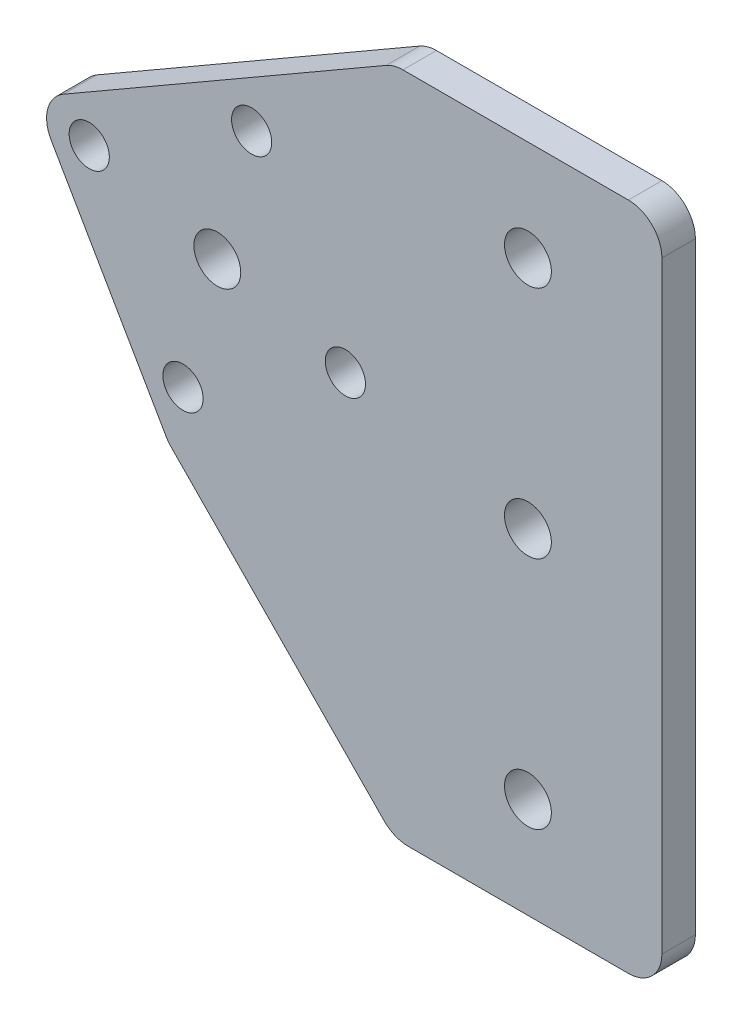
ISO-10303-21;
HEADER;
FILE_DESCRIPTION(('STEP AP214'),'2;1');
FILE_NAME('part.step','',(''),(''),'','','');
FILE_SCHEMA(('AUTOMOTIVE_DESIGN { 1 0 10303 214 1 1 1 1 }'));
ENDSEC;
DATA;
#1=APPLICATION_CONTEXT('core data for automotive mechanical design processes');
#2=APPLICATION_PROTOCOL_DEFINITION('international standard','automotive_design',2000,#1);
#3=PRODUCT_CONTEXT('',#1,'mechanical');
#4=PRODUCT('Part','Part','',(#3));
#5=PRODUCT_RELATED_PRODUCT_CATEGORY('part','',(#4));
#6=PRODUCT_DEFINITION_FORMATION('','',#4);
#7=PRODUCT_DEFINITION_CONTEXT('part definition',#1,'design');
#8=PRODUCT_DEFINITION('design','',#6,#7);
#9=PRODUCT_DEFINITION_SHAPE('','',#8);
#10=(LENGTH_UNIT() NAMED_UNIT(*) SI_UNIT(.MILLI.,.METRE.));
#11=(NAMED_UNIT(*) PLANE_ANGLE_UNIT() SI_UNIT($,.RADIAN.));
#12=(NAMED_UNIT(*) SI_UNIT($,.STERADIAN.) SOLID_ANGLE_UNIT());
#13=UNCERTAINTY_MEASURE_WITH_UNIT(LENGTH_MEASURE(1.E-05),#10,'distance_accuracy_value','');
#14=(GEOMETRIC_REPRESENTATION_CONTEXT(3) GLOBAL_UNCERTAINTY_ASSIGNED_CONTEXT((#13)) GLOBAL_UNIT_ASSIGNED_CONTEXT((#10,
#11,#12)) REPRESENTATION_CONTEXT('',''));
#15=CARTESIAN_POINT('',(0.,0.,0.));
#16=DIRECTION('',(0.,0.,1.));
#17=DIRECTION('',(1.,0.,0.));
#18=AXIS2_PLACEMENT_3D('',#15,#16,#17);
#19=CARTESIAN_POINT('',(-40.,0.,5.));
#20=DIRECTION('',(0.,1.,0.));
#21=DIRECTION('',(0.,0.,1.));
#22=AXIS2_PLACEMENT_3D('',#19,#20,#21);
#23=PLANE('',#22);
#24=DIRECTION('',(1.,0.,0.));
#25=VECTOR('',#24,1.);
#26=CARTESIAN_POINT('',(-40.,0.,0.));
#27=LINE('',#26,#25);
#28=CARTESIAN_POINT('',(-37.9002360555579,0.,0.));
#29=VERTEX_POINT('',#28);
#30=CARTESIAN_POINT('',(-5.,0.,0.));
#31=VERTEX_POINT('',#30);
#32=EDGE_CURVE('E217',#29,#31,#27,.T.);
#33=ORIENTED_EDGE('',*,*,#32,.T.);
#34=DIRECTION('',(0.,0.,-1.));
#35=VECTOR('',#34,1.);
#36=CARTESIAN_POINT('',(-5.,0.,5.));
#37=LINE('',#36,#35);
#38=CARTESIAN_POINT('',(-5.,0.,5.));
#39=VERTEX_POINT('',#38);
#40=EDGE_CURVE('E193',#31,#39,#37,.F.);
#41=ORIENTED_EDGE('',*,*,#40,.T.);
#42=DIRECTION('',(1.,0.,0.));
#43=VECTOR('',#42,1.);
#44=CARTESIAN_POINT('',(-40.,0.,5.));
#45=LINE('',#44,#43);
#46=CARTESIAN_POINT('',(-37.9002360555579,0.,5.));
#47=VERTEX_POINT('',#46);
#48=EDGE_CURVE('E160',#47,#39,#45,.T.);
#49=ORIENTED_EDGE('',*,*,#48,.F.);
#50=DIRECTION('',(0.,0.,-1.));
#51=VECTOR('',#50,1.);
#52=CARTESIAN_POINT('',(-37.9002360555579,0.,5.));
#53=LINE('',#52,#51);
#54=EDGE_CURVE('E190',#47,#29,#53,.T.);
#55=ORIENTED_EDGE('',*,*,#54,.T.);
#56=EDGE_LOOP('',(#33,#41,#49,#55));
#57=FACE_BOUND('',#56,.T.);
#58=ADVANCED_FACE('F33',(#57),#23,.F.);
#59=CARTESIAN_POINT('',(0.,0.,5.));
#60=DIRECTION('',(-1.,0.,0.));
#61=DIRECTION('',(0.,0.,1.));
#62=AXIS2_PLACEMENT_3D('',#59,#60,#61);
#63=PLANE('',#62);
#64=DIRECTION('',(0.,1.,0.));
#65=VECTOR('',#64,1.);
#66=CARTESIAN_POINT('',(0.,0.,0.));
#67=LINE('',#66,#65);
#68=CARTESIAN_POINT('',(0.,5.,0.));
#69=VERTEX_POINT('',#68);
#70=CARTESIAN_POINT('',(0.,95.,0.));
#71=VERTEX_POINT('',#70);
#72=EDGE_CURVE('E155',#69,#71,#67,.T.);
#73=ORIENTED_EDGE('',*,*,#72,.T.);
#74=DIRECTION('',(0.,0.,-1.));
#75=VECTOR('',#74,1.);
#76=CARTESIAN_POINT('',(0.,95.,5.));
#77=LINE('',#76,#75);
#78=CARTESIAN_POINT('',(0.,95.,5.));
#79=VERTEX_POINT('',#78);
#80=EDGE_CURVE('E188',#71,#79,#77,.F.);
#81=ORIENTED_EDGE('',*,*,#80,.T.);
#82=DIRECTION('',(0.,1.,0.));
#83=VECTOR('',#82,1.);
#84=CARTESIAN_POINT('',(0.,0.,5.));
#85=LINE('',#84,#83);
#86=CARTESIAN_POINT('',(0.,5.,5.));
#87=VERTEX_POINT('',#86);
#88=EDGE_CURVE('E236',#87,#79,#85,.T.);
#89=ORIENTED_EDGE('',*,*,#88,.F.);
#90=DIRECTION('',(0.,0.,-1.));
#91=VECTOR('',#90,1.);
#92=CARTESIAN_POINT('',(0.,5.,5.));
#93=LINE('',#92,#91);
#94=EDGE_CURVE('E185',#87,#69,#93,.T.);
#95=ORIENTED_EDGE('',*,*,#94,.T.);
#96=EDGE_LOOP('',(#73,#81,#89,#95));
#97=FACE_BOUND('',#96,.T.);
#98=ADVANCED_FACE('F224',(#97),#63,.F.);
#99=CARTESIAN_POINT('',(0.,100.,5.));
#100=DIRECTION('',(0.,-1.,0.));
#101=DIRECTION('',(0.,0.,-1.));
#102=AXIS2_PLACEMENT_3D('',#99,#100,#101);
#103=PLANE('',#102);
#104=DIRECTION('',(-1.,0.,0.));
#105=VECTOR('',#104,1.);
#106=CARTESIAN_POINT('',(0.,100.,0.));
#107=LINE('',#106,#105);
#108=CARTESIAN_POINT('',(-5.,100.,0.));
#109=VERTEX_POINT('',#108);
#110=CARTESIAN_POINT('',(-38.6602540378444,100.,0.));
#111=VERTEX_POINT('',#110);
#112=EDGE_CURVE('E150',#109,#111,#107,.T.);
#113=ORIENTED_EDGE('',*,*,#112,.T.);
#114=DIRECTION('',(0.,0.,-1.));
#115=VECTOR('',#114,1.);
#116=CARTESIAN_POINT('',(-38.6602540378444,100.,5.));
#117=LINE('',#116,#115);
#118=CARTESIAN_POINT('',(-38.6602540378444,100.,5.));
#119=VERTEX_POINT('',#118);
#120=EDGE_CURVE('E128',#111,#119,#117,.F.);
#121=ORIENTED_EDGE('',*,*,#120,.T.);
#122=DIRECTION('',(-1.,0.,0.));
#123=VECTOR('',#122,1.);
#124=CARTESIAN_POINT('',(0.,100.,5.));
#125=LINE('',#124,#123);
#126=CARTESIAN_POINT('',(-5.,100.,5.));
#127=VERTEX_POINT('',#126);
#128=EDGE_CURVE('E235',#127,#119,#125,.T.);
#129=ORIENTED_EDGE('',*,*,#128,.F.);
#130=DIRECTION('',(0.,0.,-1.));
#131=VECTOR('',#130,1.);
#132=CARTESIAN_POINT('',(-5.,100.,5.));
#133=LINE('',#132,#131);
#134=EDGE_CURVE('E133',#127,#109,#133,.T.);
#135=ORIENTED_EDGE('',*,*,#134,.T.);
#136=EDGE_LOOP('',(#113,#121,#129,#135));
#137=FACE_BOUND('',#136,.T.);
#138=ADVANCED_FACE('F238',(#137),#103,.F.);
#139=CARTESIAN_POINT('',(-40.,100.,5.));
#140=DIRECTION('',(0.499999999999998,-0.86602540378444,0.));
#141=DIRECTION('',(0.86602540378444,0.499999999999998,0.));
#142=AXIS2_PLACEMENT_3D('',#139,#140,#141);
#143=PLANE('',#142);
#144=DIRECTION('',(-0.86602540378444,-0.499999999999998,0.));
#145=VECTOR('',#144,1.);
#146=CARTESIAN_POINT('',(-40.,100.,5.));
#147=LINE('',#146,#145);
#148=CARTESIAN_POINT('',(-41.1602540378444,99.3301270189222,5.));
#149=VERTEX_POINT('',#148);
#150=CARTESIAN_POINT('',(-89.3634480157131,71.5000000000001,5.));
#151=VERTEX_POINT('',#150);
#152=EDGE_CURVE('E143',#149,#151,#147,.T.);
#153=ORIENTED_EDGE('',*,*,#152,.F.);
#154=DIRECTION('',(0.,0.,-1.));
#155=VECTOR('',#154,1.);
#156=CARTESIAN_POINT('',(-41.1602540378444,99.3301270189222,5.));
#157=LINE('',#156,#155);
#158=CARTESIAN_POINT('',(-41.1602540378444,99.3301270189222,0.));
#159=VERTEX_POINT('',#158);
#160=EDGE_CURVE('E127',#149,#159,#157,.T.);
#161=ORIENTED_EDGE('',*,*,#160,.T.);
#162=DIRECTION('',(-0.86602540378444,-0.499999999999998,0.));
#163=VECTOR('',#162,1.);
#164=CARTESIAN_POINT('',(-40.,100.,0.));
#165=LINE('',#164,#163);
#166=CARTESIAN_POINT('',(-89.3634480157131,71.5000000000001,0.));
#167=VERTEX_POINT('',#166);
#168=EDGE_CURVE('E140',#159,#167,#165,.T.);
#169=ORIENTED_EDGE('',*,*,#168,.T.);
#170=DIRECTION('',(0.,0.,-1.));
#171=VECTOR('',#170,1.);
#172=CARTESIAN_POINT('',(-89.3634480157131,71.5000000000001,5.));
#173=LINE('',#172,#171);
#174=EDGE_CURVE('E145',#167,#151,#173,.F.);
#175=ORIENTED_EDGE('',*,*,#174,.T.);
#176=EDGE_LOOP('',(#153,#161,#169,#175));
#177=FACE_BOUND('',#176,.T.);
#178=ADVANCED_FACE('F139',(#177),#143,.F.);
#179=CARTESIAN_POINT('',(-93.6935750346353,69.0000000000001,5.));
#180=DIRECTION('',(0.86602540378444,0.499999999999998,0.));
#181=DIRECTION('',(-0.499999999999998,0.86602540378444,0.));
#182=AXIS2_PLACEMENT_3D('',#179,#180,#181);
#183=PLANE('',#182);
#184=DIRECTION('',(0.499999999999998,-0.86602540378444,0.));
#185=VECTOR('',#184,1.);
#186=CARTESIAN_POINT('',(-93.6935750346353,69.0000000000001,0.));
#187=LINE('',#186,#185);
#188=CARTESIAN_POINT('',(-91.1935750346353,64.6698729810779,0.));
#189=VERTEX_POINT('',#188);
#190=CARTESIAN_POINT('',(-74.0102803985504,34.907533629953,0.));
#191=VERTEX_POINT('',#190);
#192=EDGE_CURVE('E149',#189,#191,#187,.T.);
#193=ORIENTED_EDGE('',*,*,#192,.T.);
#194=DIRECTION('',(0.,0.,-1.));
#195=VECTOR('',#194,1.);
#196=CARTESIAN_POINT('',(-74.0102803985504,34.907533629953,5.));
#197=LINE('',#196,#195);
#198=CARTESIAN_POINT('',(-74.0102803985504,34.907533629953,5.));
#199=VERTEX_POINT('',#198);
#200=EDGE_CURVE('E11',#191,#199,#197,.F.);
#201=ORIENTED_EDGE('',*,*,#200,.T.);
#202=DIRECTION('',(0.499999999999998,-0.86602540378444,0.));
#203=VECTOR('',#202,1.);
#204=CARTESIAN_POINT('',(-93.6935750346353,69.0000000000001,5.));
#205=LINE('',#204,#203);
#206=CARTESIAN_POINT('',(-91.1935750346353,64.6698729810779,5.));
#207=VERTEX_POINT('',#206);
#208=EDGE_CURVE('E204',#207,#199,#205,.T.);
#209=ORIENTED_EDGE('',*,*,#208,.F.);
#210=DIRECTION('',(0.,0.,-1.));
#211=VECTOR('',#210,1.);
#212=CARTESIAN_POINT('',(-91.1935750346353,64.6698729810779,5.));
#213=LINE('',#212,#211);
#214=EDGE_CURVE('E41',#207,#189,#213,.T.);
#215=ORIENTED_EDGE('',*,*,#214,.T.);
#216=EDGE_LOOP('',(#193,#201,#209,#215));
#217=FACE_BOUND('',#216,.T.);
#218=ADVANCED_FACE('F202',(#217),#183,.F.);
#219=CARTESIAN_POINT('',(-73.6935750346353,34.3589838486225,5.));
#220=DIRECTION('',(0.713986646542123,0.700159316555549,0.));
#221=DIRECTION('',(-0.700159316555549,0.713986646542123,0.));
#222=AXIS2_PLACEMENT_3D('',#219,#220,#221);
#223=PLANE('',#222);
#224=DIRECTION('',(0.700159316555549,-0.713986646542123,0.));
#225=VECTOR('',#224,1.);
#226=CARTESIAN_POINT('',(-73.6935750346353,34.3589838486225,0.));
#227=LINE('',#226,#225);
#228=CARTESIAN_POINT('',(-73.2500866123388,33.9067370471753,0.));
#229=VERTEX_POINT('',#228);
#230=CARTESIAN_POINT('',(-41.4701692882686,1.49920341722226,0.));
#231=VERTEX_POINT('',#230);
#232=EDGE_CURVE('E153',#229,#231,#227,.T.);
#233=ORIENTED_EDGE('',*,*,#232,.T.);
#234=DIRECTION('',(0.,0.,-1.));
#235=VECTOR('',#234,1.);
#236=CARTESIAN_POINT('',(-41.4701692882685,1.49920341722225,5.));
#237=LINE('',#236,#235);
#238=CARTESIAN_POINT('',(-41.4701692882686,1.49920341722226,5.));
#239=VERTEX_POINT('',#238);
#240=EDGE_CURVE('E48',#231,#239,#237,.F.);
#241=ORIENTED_EDGE('',*,*,#240,.T.);
#242=DIRECTION('',(0.700159316555549,-0.713986646542123,0.));
#243=VECTOR('',#242,1.);
#244=CARTESIAN_POINT('',(-73.6935750346353,34.3589838486225,5.));
#245=LINE('',#244,#243);
#246=CARTESIAN_POINT('',(-73.2500866123388,33.9067370471753,5.));
#247=VERTEX_POINT('',#246);
#248=EDGE_CURVE('E161',#247,#239,#245,.T.);
#249=ORIENTED_EDGE('',*,*,#248,.F.);
#250=DIRECTION('',(0.,0.,-1.));
#251=VECTOR('',#250,1.);
#252=CARTESIAN_POINT('',(-73.2500866123388,33.9067370471753,5.));
#253=LINE('',#252,#251);
#254=EDGE_CURVE('E195',#247,#229,#253,.T.);
#255=ORIENTED_EDGE('',*,*,#254,.T.);
#256=EDGE_LOOP('',(#233,#241,#249,#255));
#257=FACE_BOUND('',#256,.T.);
#258=ADVANCED_FACE('F211',(#257),#223,.F.);
#259=CARTESIAN_POINT('',(0.,0.,5.));
#260=DIRECTION('',(0.,0.,1.));
#261=DIRECTION('',(1.,0.,0.));
#262=AXIS2_PLACEMENT_3D('',#259,#260,#261);
#263=PLANE('',#262);
#264=CARTESIAN_POINT('',(-71.4974226119287,42.5551362713292,5.));
#265=DIRECTION('',(0.,0.,1.));
#266=DIRECTION('',(1.,0.,0.));
#267=AXIS2_PLACEMENT_3D('',#264,#265,#266);
#268=CIRCLE('',#267,3.00000000000002);
#269=CARTESIAN_POINT('',(-68.4974226119287,42.5551362713292,5.));
#270=VERTEX_POINT('',#269);
#271=EDGE_CURVE('E249',#270,#270,#268,.T.);
#272=ORIENTED_EDGE('',*,*,#271,.F.);
#273=EDGE_LOOP('',(#272));
#274=FACE_BOUND('',#273,.T.);
#275=CARTESIAN_POINT('',(-47.2487113059644,56.5551362713292,5.));
#276=DIRECTION('',(0.,0.,1.));
#277=DIRECTION('',(1.,0.,0.));
#278=AXIS2_PLACEMENT_3D('',#275,#276,#277);
#279=CIRCLE('',#278,3.00000000000001);
#280=CARTESIAN_POINT('',(-44.2487113059644,56.5551362713292,5.));
#281=VERTEX_POINT('',#280);
#282=EDGE_CURVE('E252',#281,#281,#279,.T.);
#283=ORIENTED_EDGE('',*,*,#282,.F.);
#284=EDGE_LOOP('',(#283));
#285=FACE_BOUND('',#284,.T.);
#286=CARTESIAN_POINT('',(-61.2487113059644,80.8038475772935,5.));
#287=DIRECTION('',(0.,0.,1.));
#288=DIRECTION('',(1.,0.,0.));
#289=AXIS2_PLACEMENT_3D('',#286,#287,#288);
#290=CIRCLE('',#289,3.00000000000002);
#291=CARTESIAN_POINT('',(-58.2487113059644,80.8038475772935,5.));
#292=VERTEX_POINT('',#291);
#293=EDGE_CURVE('E255',#292,#292,#290,.T.);
#294=ORIENTED_EDGE('',*,*,#293,.F.);
#295=EDGE_LOOP('',(#294));
#296=FACE_BOUND('',#295,.T.);
#297=CARTESIAN_POINT('',(-85.4974226119287,66.8038475772935,5.));
#298=DIRECTION('',(0.,0.,1.));
#299=DIRECTION('',(1.,0.,0.));
#300=AXIS2_PLACEMENT_3D('',#297,#298,#299);
#301=CIRCLE('',#300,3.00000000000001);
#302=CARTESIAN_POINT('',(-82.4974226119287,66.8038475772935,5.));
#303=VERTEX_POINT('',#302);
#304=EDGE_CURVE('E258',#303,#303,#301,.T.);
#305=ORIENTED_EDGE('',*,*,#304,.F.);
#306=EDGE_LOOP('',(#305));
#307=FACE_BOUND('',#306,.T.);
#308=CARTESIAN_POINT('',(-66.3730669589465,61.6794919243113,5.));
#309=DIRECTION('',(0.,0.,1.));
#310=DIRECTION('',(1.,0.,0.));
#311=AXIS2_PLACEMENT_3D('',#308,#309,#310);
#312=CIRCLE('',#311,3.50000000000001);
#313=CARTESIAN_POINT('',(-62.8730669589465,61.6794919243113,5.));
#314=VERTEX_POINT('',#313);
#315=EDGE_CURVE('E261',#314,#314,#312,.T.);
#316=ORIENTED_EDGE('',*,*,#315,.F.);
#317=EDGE_LOOP('',(#316));
#318=FACE_BOUND('',#317,.T.);
#319=CARTESIAN_POINT('',(-20.,85.,5.));
#320=DIRECTION('',(0.,0.,1.));
#321=DIRECTION('',(1.,0.,0.));
#322=AXIS2_PLACEMENT_3D('',#319,#320,#321);
#323=CIRCLE('',#322,3.5);
#324=CARTESIAN_POINT('',(-16.5,85.,5.));
#325=VERTEX_POINT('',#324);
#326=EDGE_CURVE('E264',#325,#325,#323,.T.);
#327=ORIENTED_EDGE('',*,*,#326,.F.);
#328=EDGE_LOOP('',(#327));
#329=FACE_BOUND('',#328,.T.);
#330=CARTESIAN_POINT('',(-20.,50.,5.));
#331=DIRECTION('',(0.,0.,1.));
#332=DIRECTION('',(1.,0.,0.));
#333=AXIS2_PLACEMENT_3D('',#330,#331,#332);
#334=CIRCLE('',#333,3.5);
#335=CARTESIAN_POINT('',(-16.5,50.,5.));
#336=VERTEX_POINT('',#335);
#337=EDGE_CURVE('E267',#336,#336,#334,.T.);
#338=ORIENTED_EDGE('',*,*,#337,.F.);
#339=EDGE_LOOP('',(#338));
#340=FACE_BOUND('',#339,.T.);
#341=CARTESIAN_POINT('',(-20.,15.,5.));
#342=DIRECTION('',(0.,0.,1.));
#343=DIRECTION('',(1.,0.,0.));
#344=AXIS2_PLACEMENT_3D('',#341,#342,#343);
#345=CIRCLE('',#344,3.5);
#346=CARTESIAN_POINT('',(-16.5,15.,5.));
#347=VERTEX_POINT('',#346);
#348=EDGE_CURVE('E219',#347,#347,#345,.T.);
#349=ORIENTED_EDGE('',*,*,#348,.F.);
#350=EDGE_LOOP('',(#349));
#351=FACE_BOUND('',#350,.T.);
#352=ORIENTED_EDGE('',*,*,#128,.T.);
#353=CARTESIAN_POINT('',(-38.6602540378444,95.,5.));
#354=DIRECTION('',(0.,0.,1.));
#355=DIRECTION('',(1.,0.,0.));
#356=AXIS2_PLACEMENT_3D('',#353,#354,#355);
#357=CIRCLE('',#356,5.);
#358=EDGE_CURVE('E183',#119,#149,#357,.T.);
#359=ORIENTED_EDGE('',*,*,#358,.T.);
#360=ORIENTED_EDGE('',*,*,#152,.T.);
#361=CARTESIAN_POINT('',(-86.8634480157131,67.1698729810779,5.));
#362=DIRECTION('',(0.,0.,1.));
#363=DIRECTION('',(1.,0.,0.));
#364=AXIS2_PLACEMENT_3D('',#361,#362,#363);
#365=CIRCLE('',#364,5.);
#366=EDGE_CURVE('E174',#151,#207,#365,.T.);
#367=ORIENTED_EDGE('',*,*,#366,.T.);
#368=ORIENTED_EDGE('',*,*,#208,.T.);
#369=CARTESIAN_POINT('',(-69.6801533796282,37.407533629953,5.));
#370=DIRECTION('',(0.,0.,1.));
#371=DIRECTION('',(1.,0.,0.));
#372=AXIS2_PLACEMENT_3D('',#369,#370,#371);
#373=CIRCLE('',#372,5.);
#374=EDGE_CURVE('E55',#199,#247,#373,.T.);
#375=ORIENTED_EDGE('',*,*,#374,.T.);
#376=ORIENTED_EDGE('',*,*,#248,.T.);
#377=CARTESIAN_POINT('',(-37.9002360555579,5.,5.));
#378=DIRECTION('',(0.,0.,1.));
#379=DIRECTION('',(1.,0.,0.));
#380=AXIS2_PLACEMENT_3D('',#377,#378,#379);
#381=CIRCLE('',#380,5.);
#382=EDGE_CURVE('E177',#239,#47,#381,.T.);
#383=ORIENTED_EDGE('',*,*,#382,.T.);
#384=ORIENTED_EDGE('',*,*,#48,.T.);
#385=CARTESIAN_POINT('',(-5.,5.,5.));
#386=DIRECTION('',(0.,0.,1.));
#387=DIRECTION('',(1.,0.,0.));
#388=AXIS2_PLACEMENT_3D('',#385,#386,#387);
#389=CIRCLE('',#388,5.);
#390=EDGE_CURVE('E179',#39,#87,#389,.T.);
#391=ORIENTED_EDGE('',*,*,#390,.T.);
#392=ORIENTED_EDGE('',*,*,#88,.T.);
#393=CARTESIAN_POINT('',(-5.,95.,5.));
#394=DIRECTION('',(0.,0.,1.));
#395=DIRECTION('',(1.,0.,0.));
#396=AXIS2_PLACEMENT_3D('',#393,#394,#395);
#397=CIRCLE('',#396,5.);
#398=EDGE_CURVE('E181',#79,#127,#397,.T.);
#399=ORIENTED_EDGE('',*,*,#398,.T.);
#400=EDGE_LOOP('',(#352,#359,#360,#367,#368,#375,#376,#383,#384,#391,#392,#399));
#401=FACE_BOUND('',#400,.T.);
#402=ADVANCED_FACE('F234',(#274,#285,#296,#307,#318,#329,#340,#351,#401),#263,.T.);
#403=CARTESIAN_POINT('',(0.,0.,0.));
#404=DIRECTION('',(0.,0.,1.));
#405=DIRECTION('',(1.,0.,0.));
#406=AXIS2_PLACEMENT_3D('',#403,#404,#405);
#407=PLANE('',#406);
#408=CARTESIAN_POINT('',(-71.4974226119287,42.5551362713292,0.));
#409=DIRECTION('',(0.,0.,1.));
#410=DIRECTION('',(-1.,0.,0.));
#411=AXIS2_PLACEMENT_3D('',#408,#409,#410);
#412=CIRCLE('',#411,3.00000000000002);
#413=CARTESIAN_POINT('',(-74.4974226119287,42.5551362713292,0.));
#414=VERTEX_POINT('',#413);
#415=EDGE_CURVE('E280',#414,#414,#412,.T.);
#416=ORIENTED_EDGE('',*,*,#415,.T.);
#417=EDGE_LOOP('',(#416));
#418=FACE_BOUND('',#417,.T.);
#419=CARTESIAN_POINT('',(-47.2487113059644,56.5551362713292,0.));
#420=DIRECTION('',(0.,0.,1.));
#421=DIRECTION('',(1.,0.,0.));
#422=AXIS2_PLACEMENT_3D('',#419,#420,#421);
#423=CIRCLE('',#422,3.00000000000001);
#424=CARTESIAN_POINT('',(-44.2487113059644,56.5551362713292,0.));
#425=VERTEX_POINT('',#424);
#426=EDGE_CURVE('E283',#425,#425,#423,.T.);
#427=ORIENTED_EDGE('',*,*,#426,.T.);
#428=EDGE_LOOP('',(#427));
#429=FACE_BOUND('',#428,.T.);
#430=CARTESIAN_POINT('',(-61.2487113059644,80.8038475772935,0.));
#431=DIRECTION('',(0.,0.,1.));
#432=DIRECTION('',(-1.,0.,0.));
#433=AXIS2_PLACEMENT_3D('',#430,#431,#432);
#434=CIRCLE('',#433,3.00000000000002);
#435=CARTESIAN_POINT('',(-64.2487113059644,80.8038475772935,0.));
#436=VERTEX_POINT('',#435);
#437=EDGE_CURVE('E286',#436,#436,#434,.T.);
#438=ORIENTED_EDGE('',*,*,#437,.T.);
#439=EDGE_LOOP('',(#438));
#440=FACE_BOUND('',#439,.T.);
#441=CARTESIAN_POINT('',(-85.4974226119287,66.8038475772935,0.));
#442=DIRECTION('',(0.,0.,1.));
#443=DIRECTION('',(1.,0.,0.));
#444=AXIS2_PLACEMENT_3D('',#441,#442,#443);
#445=CIRCLE('',#444,3.00000000000001);
#446=CARTESIAN_POINT('',(-82.4974226119287,66.8038475772935,0.));
#447=VERTEX_POINT('',#446);
#448=EDGE_CURVE('E275',#447,#447,#445,.T.);
#449=ORIENTED_EDGE('',*,*,#448,.T.);
#450=EDGE_LOOP('',(#449));
#451=FACE_BOUND('',#450,.T.);
#452=CARTESIAN_POINT('',(-66.3730669589465,61.6794919243113,0.));
#453=DIRECTION('',(0.,0.,1.));
#454=DIRECTION('',(1.,0.,0.));
#455=AXIS2_PLACEMENT_3D('',#452,#453,#454);
#456=CIRCLE('',#455,3.50000000000001);
#457=CARTESIAN_POINT('',(-62.8730669589465,61.6794919243113,0.));
#458=VERTEX_POINT('',#457);
#459=EDGE_CURVE('E271',#458,#458,#456,.T.);
#460=ORIENTED_EDGE('',*,*,#459,.T.);
#461=EDGE_LOOP('',(#460));
#462=FACE_BOUND('',#461,.T.);
#463=CARTESIAN_POINT('',(-20.,85.,0.));
#464=DIRECTION('',(0.,0.,1.));
#465=DIRECTION('',(-1.,0.,0.));
#466=AXIS2_PLACEMENT_3D('',#463,#464,#465);
#467=CIRCLE('',#466,3.5);
#468=CARTESIAN_POINT('',(-23.5,85.,0.));
#469=VERTEX_POINT('',#468);
#470=EDGE_CURVE('E274',#469,#469,#467,.T.);
#471=ORIENTED_EDGE('',*,*,#470,.T.);
#472=EDGE_LOOP('',(#471));
#473=FACE_BOUND('',#472,.T.);
#474=CARTESIAN_POINT('',(-20.,50.,0.));
#475=DIRECTION('',(0.,0.,1.));
#476=DIRECTION('',(1.,0.,0.));
#477=AXIS2_PLACEMENT_3D('',#474,#475,#476);
#478=CIRCLE('',#477,3.5);
#479=CARTESIAN_POINT('',(-16.5,50.,0.));
#480=VERTEX_POINT('',#479);
#481=EDGE_CURVE('E270',#480,#480,#478,.T.);
#482=ORIENTED_EDGE('',*,*,#481,.T.);
#483=EDGE_LOOP('',(#482));
#484=FACE_BOUND('',#483,.T.);
#485=CARTESIAN_POINT('',(-20.,15.,0.));
#486=DIRECTION('',(0.,0.,1.));
#487=DIRECTION('',(1.,0.,0.));
#488=AXIS2_PLACEMENT_3D('',#485,#486,#487);
#489=CIRCLE('',#488,3.5);
#490=CARTESIAN_POINT('',(-16.5,15.,0.));
#491=VERTEX_POINT('',#490);
#492=EDGE_CURVE('E246',#491,#491,#489,.T.);
#493=ORIENTED_EDGE('',*,*,#492,.T.);
#494=EDGE_LOOP('',(#493));
#495=FACE_BOUND('',#494,.T.);
#496=ORIENTED_EDGE('',*,*,#168,.F.);
#497=CARTESIAN_POINT('',(-38.6602540378444,95.,0.));
#498=DIRECTION('',(0.,0.,1.));
#499=DIRECTION('',(1.,0.,0.));
#500=AXIS2_PLACEMENT_3D('',#497,#498,#499);
#501=CIRCLE('',#500,5.);
#502=EDGE_CURVE('E123',#159,#111,#501,.F.);
#503=ORIENTED_EDGE('',*,*,#502,.T.);
#504=ORIENTED_EDGE('',*,*,#112,.F.);
#505=CARTESIAN_POINT('',(-5.,95.,0.));
#506=DIRECTION('',(0.,0.,1.));
#507=DIRECTION('',(1.,0.,0.));
#508=AXIS2_PLACEMENT_3D('',#505,#506,#507);
#509=CIRCLE('',#508,5.);
#510=EDGE_CURVE('E134',#109,#71,#509,.F.);
#511=ORIENTED_EDGE('',*,*,#510,.T.);
#512=ORIENTED_EDGE('',*,*,#72,.F.);
#513=CARTESIAN_POINT('',(-5.,5.,0.));
#514=DIRECTION('',(0.,0.,1.));
#515=DIRECTION('',(1.,0.,0.));
#516=AXIS2_PLACEMENT_3D('',#513,#514,#515);
#517=CIRCLE('',#516,5.);
#518=EDGE_CURVE('E168',#69,#31,#517,.F.);
#519=ORIENTED_EDGE('',*,*,#518,.T.);
#520=ORIENTED_EDGE('',*,*,#32,.F.);
#521=CARTESIAN_POINT('',(-37.9002360555579,5.,0.));
#522=DIRECTION('',(0.,0.,1.));
#523=DIRECTION('',(1.,0.,0.));
#524=AXIS2_PLACEMENT_3D('',#521,#522,#523);
#525=CIRCLE('',#524,5.);
#526=EDGE_CURVE('E166',#29,#231,#525,.F.);
#527=ORIENTED_EDGE('',*,*,#526,.T.);
#528=ORIENTED_EDGE('',*,*,#232,.F.);
#529=CARTESIAN_POINT('',(-69.6801533796282,37.407533629953,0.));
#530=DIRECTION('',(0.,0.,1.));
#531=DIRECTION('',(1.,0.,0.));
#532=AXIS2_PLACEMENT_3D('',#529,#530,#531);
#533=CIRCLE('',#532,5.);
#534=EDGE_CURVE('E164',#229,#191,#533,.F.);
#535=ORIENTED_EDGE('',*,*,#534,.T.);
#536=ORIENTED_EDGE('',*,*,#192,.F.);
#537=CARTESIAN_POINT('',(-86.8634480157131,67.1698729810779,0.));
#538=DIRECTION('',(0.,0.,1.));
#539=DIRECTION('',(1.,0.,0.));
#540=AXIS2_PLACEMENT_3D('',#537,#538,#539);
#541=CIRCLE('',#540,5.);
#542=EDGE_CURVE('E144',#189,#167,#541,.F.);
#543=ORIENTED_EDGE('',*,*,#542,.T.);
#544=EDGE_LOOP('',(#496,#503,#504,#511,#512,#519,#520,#527,#528,#535,#536,#543));
#545=FACE_BOUND('',#544,.T.);
#546=ADVANCED_FACE('F147',(#418,#429,#440,#451,#462,#473,#484,#495,#545),#407,.F.);
#547=CARTESIAN_POINT('',(-20.,15.,0.));
#548=DIRECTION('',(0.,0.,1.));
#549=DIRECTION('',(1.,0.,0.));
#550=AXIS2_PLACEMENT_3D('',#547,#548,#549);
#551=CYLINDRICAL_SURFACE('',#550,3.5);
#552=ORIENTED_EDGE('',*,*,#348,.T.);
#553=EDGE_LOOP('',(#552));
#554=FACE_BOUND('',#553,.T.);
#555=ORIENTED_EDGE('',*,*,#492,.F.);
#556=EDGE_LOOP('',(#555));
#557=FACE_BOUND('',#556,.T.);
#558=ADVANCED_FACE('F376',(#554,#557),#551,.F.);
#559=CARTESIAN_POINT('',(-20.,50.,0.));
#560=DIRECTION('',(0.,0.,1.));
#561=DIRECTION('',(1.,0.,0.));
#562=AXIS2_PLACEMENT_3D('',#559,#560,#561);
#563=CYLINDRICAL_SURFACE('',#562,3.5);
#564=ORIENTED_EDGE('',*,*,#337,.T.);
#565=EDGE_LOOP('',(#564));
#566=FACE_BOUND('',#565,.T.);
#567=ORIENTED_EDGE('',*,*,#481,.F.);
#568=EDGE_LOOP('',(#567));
#569=FACE_BOUND('',#568,.T.);
#570=ADVANCED_FACE('F470',(#566,#569),#563,.F.);
#571=CARTESIAN_POINT('',(-20.,85.,0.));
#572=DIRECTION('',(0.,0.,1.));
#573=DIRECTION('',(1.,0.,0.));
#574=AXIS2_PLACEMENT_3D('',#571,#572,#573);
#575=CYLINDRICAL_SURFACE('',#574,3.5);
#576=ORIENTED_EDGE('',*,*,#326,.T.);
#577=EDGE_LOOP('',(#576));
#578=FACE_BOUND('',#577,.T.);
#579=ORIENTED_EDGE('',*,*,#470,.F.);
#580=EDGE_LOOP('',(#579));
#581=FACE_BOUND('',#580,.T.);
#582=ADVANCED_FACE('F307',(#578,#581),#575,.F.);
#583=CARTESIAN_POINT('',(-66.3730669589465,61.6794919243113,0.));
#584=DIRECTION('',(0.,0.,1.));
#585=DIRECTION('',(1.,0.,0.));
#586=AXIS2_PLACEMENT_3D('',#583,#584,#585);
#587=CYLINDRICAL_SURFACE('',#586,3.50000000000001);
#588=ORIENTED_EDGE('',*,*,#315,.T.);
#589=EDGE_LOOP('',(#588));
#590=FACE_BOUND('',#589,.T.);
#591=ORIENTED_EDGE('',*,*,#459,.F.);
#592=EDGE_LOOP('',(#591));
#593=FACE_BOUND('',#592,.T.);
#594=ADVANCED_FACE('F297',(#590,#593),#587,.F.);
#595=CARTESIAN_POINT('',(-85.4974226119287,66.8038475772935,0.));
#596=DIRECTION('',(0.,0.,1.));
#597=DIRECTION('',(1.,0.,0.));
#598=AXIS2_PLACEMENT_3D('',#595,#596,#597);
#599=CYLINDRICAL_SURFACE('',#598,3.00000000000001);
#600=ORIENTED_EDGE('',*,*,#304,.T.);
#601=EDGE_LOOP('',(#600));
#602=FACE_BOUND('',#601,.T.);
#603=ORIENTED_EDGE('',*,*,#448,.F.);
#604=EDGE_LOOP('',(#603));
#605=FACE_BOUND('',#604,.T.);
#606=ADVANCED_FACE('F294',(#602,#605),#599,.F.);
#607=CARTESIAN_POINT('',(-61.2487113059644,80.8038475772935,0.));
#608=DIRECTION('',(0.,0.,1.));
#609=DIRECTION('',(1.,0.,0.));
#610=AXIS2_PLACEMENT_3D('',#607,#608,#609);
#611=CYLINDRICAL_SURFACE('',#610,3.00000000000002);
#612=ORIENTED_EDGE('',*,*,#293,.T.);
#613=EDGE_LOOP('',(#612));
#614=FACE_BOUND('',#613,.T.);
#615=ORIENTED_EDGE('',*,*,#437,.F.);
#616=EDGE_LOOP('',(#615));
#617=FACE_BOUND('',#616,.T.);
#618=ADVANCED_FACE('F296',(#614,#617),#611,.F.);
#619=CARTESIAN_POINT('',(-47.2487113059644,56.5551362713292,0.));
#620=DIRECTION('',(0.,0.,1.));
#621=DIRECTION('',(1.,0.,0.));
#622=AXIS2_PLACEMENT_3D('',#619,#620,#621);
#623=CYLINDRICAL_SURFACE('',#622,3.00000000000001);
#624=ORIENTED_EDGE('',*,*,#282,.T.);
#625=EDGE_LOOP('',(#624));
#626=FACE_BOUND('',#625,.T.);
#627=ORIENTED_EDGE('',*,*,#426,.F.);
#628=EDGE_LOOP('',(#627));
#629=FACE_BOUND('',#628,.T.);
#630=ADVANCED_FACE('F304',(#626,#629),#623,.F.);
#631=CARTESIAN_POINT('',(-71.4974226119287,42.5551362713292,0.));
#632=DIRECTION('',(0.,0.,1.));
#633=DIRECTION('',(1.,0.,0.));
#634=AXIS2_PLACEMENT_3D('',#631,#632,#633);
#635=CYLINDRICAL_SURFACE('',#634,3.00000000000002);
#636=ORIENTED_EDGE('',*,*,#271,.T.);
#637=EDGE_LOOP('',(#636));
#638=FACE_BOUND('',#637,.T.);
#639=ORIENTED_EDGE('',*,*,#415,.F.);
#640=EDGE_LOOP('',(#639));
#641=FACE_BOUND('',#640,.T.);
#642=ADVANCED_FACE('F321',(#638,#641),#635,.F.);
#643=CARTESIAN_POINT('',(-38.6602540378444,95.,5.));
#644=DIRECTION('',(0.,0.,-1.));
#645=DIRECTION('',(-1.,0.,0.));
#646=AXIS2_PLACEMENT_3D('',#643,#644,#645);
#647=CYLINDRICAL_SURFACE('',#646,5.);
#648=ORIENTED_EDGE('',*,*,#358,.F.);
#649=ORIENTED_EDGE('',*,*,#120,.F.);
#650=ORIENTED_EDGE('',*,*,#502,.F.);
#651=ORIENTED_EDGE('',*,*,#160,.F.);
#652=EDGE_LOOP('',(#648,#649,#650,#651));
#653=FACE_BOUND('',#652,.T.);
#654=ADVANCED_FACE('F126',(#653),#647,.T.);
#655=CARTESIAN_POINT('',(-5.,95.,5.));
#656=DIRECTION('',(0.,0.,-1.));
#657=DIRECTION('',(-1.,0.,0.));
#658=AXIS2_PLACEMENT_3D('',#655,#656,#657);
#659=CYLINDRICAL_SURFACE('',#658,5.);
#660=ORIENTED_EDGE('',*,*,#398,.F.);
#661=ORIENTED_EDGE('',*,*,#80,.F.);
#662=ORIENTED_EDGE('',*,*,#510,.F.);
#663=ORIENTED_EDGE('',*,*,#134,.F.);
#664=EDGE_LOOP('',(#660,#661,#662,#663));
#665=FACE_BOUND('',#664,.T.);
#666=ADVANCED_FACE('F230',(#665),#659,.T.);
#667=CARTESIAN_POINT('',(-5.,5.,5.));
#668=DIRECTION('',(0.,0.,-1.));
#669=DIRECTION('',(-1.,0.,0.));
#670=AXIS2_PLACEMENT_3D('',#667,#668,#669);
#671=CYLINDRICAL_SURFACE('',#670,5.);
#672=ORIENTED_EDGE('',*,*,#390,.F.);
#673=ORIENTED_EDGE('',*,*,#40,.F.);
#674=ORIENTED_EDGE('',*,*,#518,.F.);
#675=ORIENTED_EDGE('',*,*,#94,.F.);
#676=EDGE_LOOP('',(#672,#673,#674,#675));
#677=FACE_BOUND('',#676,.T.);
#678=ADVANCED_FACE('F324',(#677),#671,.T.);
#679=CARTESIAN_POINT('',(-37.9002360555579,5.,5.));
#680=DIRECTION('',(0.,0.,-1.));
#681=DIRECTION('',(-1.,0.,0.));
#682=AXIS2_PLACEMENT_3D('',#679,#680,#681);
#683=CYLINDRICAL_SURFACE('',#682,5.);
#684=ORIENTED_EDGE('',*,*,#382,.F.);
#685=ORIENTED_EDGE('',*,*,#240,.F.);
#686=ORIENTED_EDGE('',*,*,#526,.F.);
#687=ORIENTED_EDGE('',*,*,#54,.F.);
#688=EDGE_LOOP('',(#684,#685,#686,#687));
#689=FACE_BOUND('',#688,.T.);
#690=ADVANCED_FACE('F327',(#689),#683,.T.);
#691=CARTESIAN_POINT('',(-69.6801533796282,37.407533629953,5.));
#692=DIRECTION('',(0.,0.,-1.));
#693=DIRECTION('',(-1.,0.,0.));
#694=AXIS2_PLACEMENT_3D('',#691,#692,#693);
#695=CYLINDRICAL_SURFACE('',#694,5.);
#696=ORIENTED_EDGE('',*,*,#374,.F.);
#697=ORIENTED_EDGE('',*,*,#200,.F.);
#698=ORIENTED_EDGE('',*,*,#534,.F.);
#699=ORIENTED_EDGE('',*,*,#254,.F.);
#700=EDGE_LOOP('',(#696,#697,#698,#699));
#701=FACE_BOUND('',#700,.T.);
#702=ADVANCED_FACE('F210',(#701),#695,.T.);
#703=CARTESIAN_POINT('',(-86.8634480157131,67.1698729810779,5.));
#704=DIRECTION('',(0.,0.,-1.));
#705=DIRECTION('',(-1.,0.,0.));
#706=AXIS2_PLACEMENT_3D('',#703,#704,#705);
#707=CYLINDRICAL_SURFACE('',#706,5.);
#708=ORIENTED_EDGE('',*,*,#366,.F.);
#709=ORIENTED_EDGE('',*,*,#174,.F.);
#710=ORIENTED_EDGE('',*,*,#542,.F.);
#711=ORIENTED_EDGE('',*,*,#214,.F.);
#712=EDGE_LOOP('',(#708,#709,#710,#711));
#713=FACE_BOUND('',#712,.T.);
#714=ADVANCED_FACE('F35',(#713),#707,.T.);
#715=CLOSED_SHELL('',(#58,#98,#138,#178,#218,#258,#402,#546,#558,#570,#582,#594,#606,#618,#630,
#642,#654,#666,#678,#690,#702,#714));
#716=MANIFOLD_SOLID_BREP('B2',#715);
#717=ADVANCED_BREP_SHAPE_REPRESENTATION('',(#18,#716),#14);
#718=SHAPE_DEFINITION_REPRESENTATION(#9,#717);
ENDSEC;
END-ISO-10303-21;
